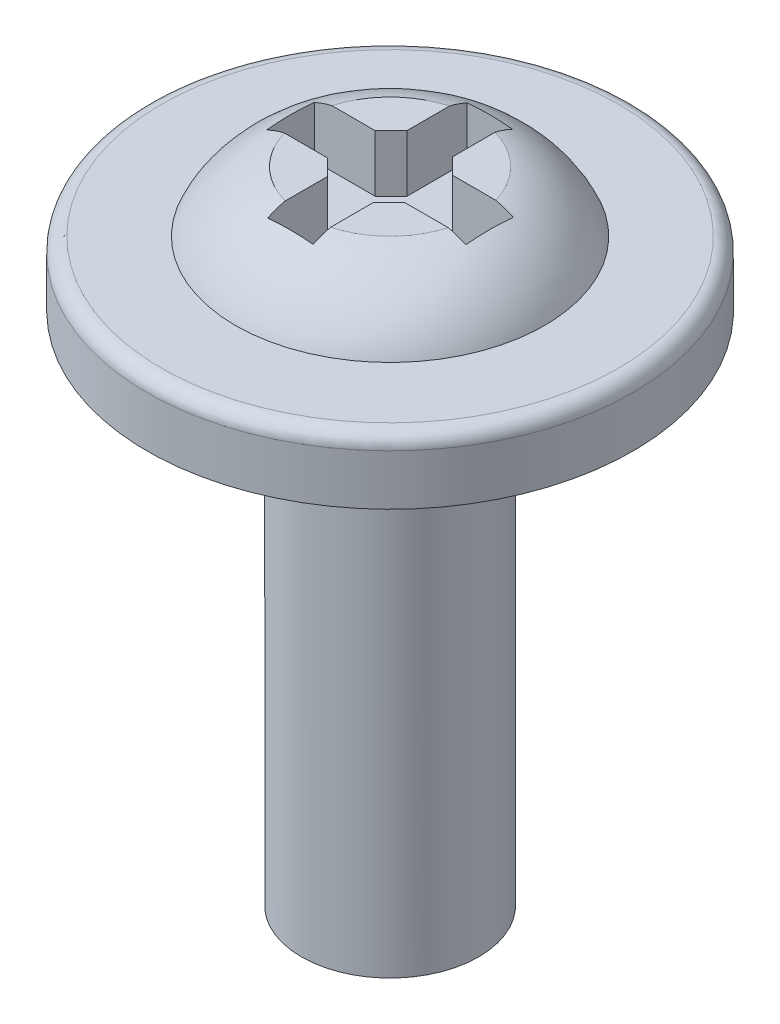
ISO-10303-21;
HEADER;
FILE_DESCRIPTION(('STEP AP214'),'2;1');
FILE_NAME('part.step','',(''),(''),'','','');
FILE_SCHEMA(('AUTOMOTIVE_DESIGN { 1 0 10303 214 1 1 1 1 }'));
ENDSEC;
DATA;
#1=APPLICATION_CONTEXT('core data for automotive mechanical design processes');
#2=APPLICATION_PROTOCOL_DEFINITION('international standard','automotive_design',2000,#1);
#3=PRODUCT_CONTEXT('',#1,'mechanical');
#4=PRODUCT('Part','Part','',(#3));
#5=PRODUCT_RELATED_PRODUCT_CATEGORY('part','',(#4));
#6=PRODUCT_DEFINITION_FORMATION('','',#4);
#7=PRODUCT_DEFINITION_CONTEXT('part definition',#1,'design');
#8=PRODUCT_DEFINITION('design','',#6,#7);
#9=PRODUCT_DEFINITION_SHAPE('','',#8);
#10=(LENGTH_UNIT() NAMED_UNIT(*) SI_UNIT(.MILLI.,.METRE.));
#11=(NAMED_UNIT(*) PLANE_ANGLE_UNIT() SI_UNIT($,.RADIAN.));
#12=(NAMED_UNIT(*) SI_UNIT($,.STERADIAN.) SOLID_ANGLE_UNIT());
#13=UNCERTAINTY_MEASURE_WITH_UNIT(LENGTH_MEASURE(1.E-05),#10,'distance_accuracy_value','');
#14=(GEOMETRIC_REPRESENTATION_CONTEXT(3) GLOBAL_UNCERTAINTY_ASSIGNED_CONTEXT((#13)) GLOBAL_UNIT_ASSIGNED_CONTEXT((#10,
#11,#12)) REPRESENTATION_CONTEXT('',''));
#15=CARTESIAN_POINT('',(0.,0.,0.));
#16=DIRECTION('',(0.,0.,1.));
#17=DIRECTION('',(1.,0.,0.));
#18=AXIS2_PLACEMENT_3D('',#15,#16,#17);
#19=CARTESIAN_POINT('',(0.,9.144,-1.905));
#20=CARTESIAN_POINT('',(0.,9.01320157506182,-2.48585998432291));
#21=CARTESIAN_POINT('',(0.,8.48184418233243,-3.16981228226771));
#22=CARTESIAN_POINT('',(0.,7.7978,-3.4544));
#23=B_SPLINE_CURVE_WITH_KNOTS('',3,(#19,#20,#21,#22),.UNSPECIFIED.,.F.,.F.,(4,4),(0.,1.),.UNSPECIFIED.);
#24=CARTESIAN_POINT('',(0.,0.,0.));
#25=DIRECTION('',(0.,-1.,0.));
#26=AXIS1_PLACEMENT('',#24,#25);
#27=SURFACE_OF_REVOLUTION('',#23,#26);
#28=CARTESIAN_POINT('',(0.,7.7978,0.));
#29=DIRECTION('',(0.,-1.,0.));
#30=DIRECTION('',(0.,0.,-1.));
#31=AXIS2_PLACEMENT_3D('',#28,#29,#30);
#32=CIRCLE('',#31,3.4544);
#33=CARTESIAN_POINT('',(0.,7.7978,-3.4544));
#34=VERTEX_POINT('',#33);
#35=EDGE_CURVE('E326',#34,#34,#32,.T.);
#36=ORIENTED_EDGE('',*,*,#35,.F.);
#37=EDGE_LOOP('',(#36));
#38=FACE_BOUND('',#37,.T.);
#39=CARTESIAN_POINT('',(-2.22356907078531,9.00798065412943,0.530600214329886));
#40=CARTESIAN_POINT('',(-2.20251859517427,9.01785875233319,0.530600214329887));
#41=CARTESIAN_POINT('',(-2.18130915061745,9.02740125202562,0.530600214329888));
#42=CARTESIAN_POINT('',(-2.13863931356944,9.04574501131848,0.530600214329889));
#43=CARTESIAN_POINT('',(-2.11717974075077,9.05454817904772,0.530600214329889));
#44=CARTESIAN_POINT('',(-2.07399660062318,9.0713837822004,0.530600214329889));
#45=CARTESIAN_POINT('',(-2.05227347592328,9.07941735013567,0.530600214329889));
#46=CARTESIAN_POINT('',(-2.00853950348615,9.09467652220501,0.530600214329889));
#47=CARTESIAN_POINT('',(-1.98652859427027,9.10190195044117,0.530600214329889));
#48=CARTESIAN_POINT('',(-1.94221027994457,9.11549093012651,0.530600214329889));
#49=CARTESIAN_POINT('',(-1.91990253137907,9.12185336652201,0.530600214329889));
#50=CARTESIAN_POINT('',(-1.87497312131895,9.1336498718535,0.530600214329889));
#51=CARTESIAN_POINT('',(-1.85235072870513,9.13908115092384,0.530600214329888));
#52=CARTESIAN_POINT('',(-1.82961427971938,9.144,0.530600214329888));
#53=B_SPLINE_CURVE_WITH_KNOTS('',3,(#39,#40,#41,#42,#43,#44,#45,#46,#47,#48,#49,#50,#51,#52),
.UNSPECIFIED.,.F.,.F.,(4,2,2,2,2,2,4),(0.,0.0697578375622904,0.139329720273001,
0.208797598407411,0.278280567461784,0.347852475761829,0.417629319570373),.UNSPECIFIED.);
#54=CARTESIAN_POINT('',(-2.22356907078532,9.00798065412943,0.530600214329889));
#55=VERTEX_POINT('',#54);
#56=CARTESIAN_POINT('',(-1.82961427971938,9.144,0.530600214329889));
#57=VERTEX_POINT('',#56);
#58=EDGE_CURVE('E321',#55,#57,#53,.T.);
#59=ORIENTED_EDGE('',*,*,#58,.F.);
#60=CARTESIAN_POINT('',(-2.22356907078531,9.00798065412943,0.530600214329886));
#61=CARTESIAN_POINT('',(-2.22356907078531,9.01292172062073,0.486453609451828));
#62=CARTESIAN_POINT('',(-2.22356907078532,9.01719128878245,0.442233933670321));
#63=CARTESIAN_POINT('',(-2.22356907078532,9.02443906175817,0.353789726310259));
#64=CARTESIAN_POINT('',(-2.22356907078532,9.02742017864067,0.309565434046432));
#65=CARTESIAN_POINT('',(-2.22356907078532,9.0321611274982,0.221116816199245));
#66=CARTESIAN_POINT('',(-2.22356907078532,9.03392273353333,0.176892584649752));
#67=CARTESIAN_POINT('',(-2.22356907078532,9.03626588327743,0.0884455535069008));
#68=CARTESIAN_POINT('',(-2.22356907078532,9.0368482934057,0.044222776753449));
#69=CARTESIAN_POINT('',(-2.22356907078532,9.0368482934057,-0.0442227767534545));
#70=CARTESIAN_POINT('',(-2.22356907078532,9.03626588327742,-0.0884455535069062));
#71=CARTESIAN_POINT('',(-2.22356907078532,9.03392273353333,-0.176892584649757));
#72=CARTESIAN_POINT('',(-2.22356907078532,9.0321611274982,-0.22111681619925));
#73=CARTESIAN_POINT('',(-2.22356907078532,9.02742017864067,-0.309565434046438));
#74=CARTESIAN_POINT('',(-2.22356907078532,9.02443906175817,-0.353789726310264));
#75=CARTESIAN_POINT('',(-2.22356907078532,9.01719128878245,-0.442233933670327));
#76=CARTESIAN_POINT('',(-2.22356907078532,9.01292172062073,-0.486453609451833));
#77=CARTESIAN_POINT('',(-2.22356907078532,9.00798065412942,-0.53060021432989));
#78=B_SPLINE_CURVE_WITH_KNOTS('',3,(#60,#61,#62,#63,#64,#65,#66,#67,#68,#69,#70,#71,#72,#73,#74,
#75,#76,#77),.UNSPECIFIED.,.F.,.F.,(4,2,2,2,2,2,2,2,4),(0.,0.13325858394194,0.266214390718465,
0.398976373822808,0.531640774033104,0.6643051742434,0.797067157347742,0.930022964124267,
1.06328154806621),.UNSPECIFIED.);
#79=CARTESIAN_POINT('',(-2.22356907078532,9.00798065412942,-0.53060021432989));
#80=VERTEX_POINT('',#79);
#81=EDGE_CURVE('E452',#55,#80,#78,.T.);
#82=ORIENTED_EDGE('',*,*,#81,.T.);
#83=CARTESIAN_POINT('',(-1.82961427971938,9.144,-0.530600214329889));
#84=CARTESIAN_POINT('',(-1.85235072870513,9.13908115092384,-0.53060021432989));
#85=CARTESIAN_POINT('',(-1.87497312131895,9.1336498718535,-0.53060021432989));
#86=CARTESIAN_POINT('',(-1.91990253137907,9.12185336652201,-0.53060021432989));
#87=CARTESIAN_POINT('',(-1.94221027994457,9.11549093012651,-0.53060021432989));
#88=CARTESIAN_POINT('',(-1.98652859427027,9.10190195044117,-0.53060021432989));
#89=CARTESIAN_POINT('',(-2.00853950348615,9.094676522205,-0.53060021432989));
#90=CARTESIAN_POINT('',(-2.05227347592329,9.07941735013567,-0.53060021432989));
#91=CARTESIAN_POINT('',(-2.07399660062318,9.0713837822004,-0.53060021432989));
#92=CARTESIAN_POINT('',(-2.11717974075078,9.05454817904772,-0.53060021432989));
#93=CARTESIAN_POINT('',(-2.13863931356945,9.04574501131848,-0.53060021432989));
#94=CARTESIAN_POINT('',(-2.18130915061746,9.02740125202562,-0.53060021432989));
#95=CARTESIAN_POINT('',(-2.20251859517428,9.01785875233318,-0.53060021432989));
#96=CARTESIAN_POINT('',(-2.22356907078531,9.00798065412941,-0.53060021432989));
#97=B_SPLINE_CURVE_WITH_KNOTS('',3,(#83,#84,#85,#86,#87,#88,#89,#90,#91,#92,#93,#94,#95,#96),
.UNSPECIFIED.,.F.,.F.,(4,2,2,2,2,2,4),(0.,0.069776843808546,0.139348752108593,0.208831721162967,
0.27829959929738,0.347871482008092,0.417629319570383),.UNSPECIFIED.);
#98=CARTESIAN_POINT('',(-1.82961427971938,9.144,-0.53060021432989));
#99=VERTEX_POINT('',#98);
#100=EDGE_CURVE('E327',#99,#80,#97,.T.);
#101=ORIENTED_EDGE('',*,*,#100,.F.);
#102=CARTESIAN_POINT('',(0.,9.144,0.));
#103=DIRECTION('',(0.,-1.,0.));
#104=DIRECTION('',(0.,0.,-1.));
#105=AXIS2_PLACEMENT_3D('',#102,#103,#104);
#106=CIRCLE('',#105,1.905);
#107=CARTESIAN_POINT('',(-0.508,9.144,-1.83601770143972));
#108=VERTEX_POINT('',#107);
#109=EDGE_CURVE('E351',#99,#108,#106,.T.);
#110=ORIENTED_EDGE('',*,*,#109,.T.);
#111=CARTESIAN_POINT('',(-0.508,9.144,-1.83601770143972));
#112=CARTESIAN_POINT('',(-0.508,9.13907728666221,-1.85869246368517));
#113=CARTESIAN_POINT('',(-0.508,9.1336422043337,-1.88125275403727));
#114=CARTESIAN_POINT('',(-0.508,9.12183893006872,-1.92605738722141));
#115=CARTESIAN_POINT('',(-0.508,9.11547353121335,-1.94830246446108));
#116=CARTESIAN_POINT('',(-0.508,9.10188009672631,-1.99249509073535));
#117=CARTESIAN_POINT('',(-0.508,9.09465317478961,-2.01444298391083));
#118=CARTESIAN_POINT('',(-0.508,9.07939290720724,-2.0580506972434));
#119=CARTESIAN_POINT('',(-0.508,9.07135973904738,-2.07971057961896));
#120=CARTESIAN_POINT('',(-0.508,9.05452708870218,-2.12276723828017));
#121=CARTESIAN_POINT('',(-0.508,9.04572647496224,-2.14416357110202));
#122=CARTESIAN_POINT('',(-0.508,9.02739016879894,-2.18670705080968));
#123=CARTESIAN_POINT('',(-0.508,9.01785257261316,-2.20785337780708));
#124=CARTESIAN_POINT('',(-0.508,9.00798065412942,-2.22884095439759));
#125=B_SPLINE_CURVE_WITH_KNOTS('',3,(#111,#112,#113,#114,#115,#116,#117,#118,#119,#120,#121,
#122,#123,#124),.UNSPECIFIED.,.F.,.F.,(4,2,2,2,2,2,4),(0.,0.069598365843174,0.138991913436484,
0.208296709070974,0.277586281379518,0.346979802814841,0.416558992350354),.UNSPECIFIED.);
#126=CARTESIAN_POINT('',(-0.508,9.00798065412944,-2.2288409543976));
#127=VERTEX_POINT('',#126);
#128=EDGE_CURVE('E415',#108,#127,#125,.T.);
#129=ORIENTED_EDGE('',*,*,#128,.T.);
#130=CARTESIAN_POINT('',(0.508000000000002,9.00798065412944,-2.22884095439759));
#131=CARTESIAN_POINT('',(0.465727683927626,9.01251055623519,-2.22884095439759));
#132=CARTESIAN_POINT('',(0.423391520364506,9.01642906411814,-2.2288409543976));
#133=CARTESIAN_POINT('',(0.338715286841423,9.02308657478128,-2.2288409543976));
#134=CARTESIAN_POINT('',(0.296375409730574,9.02582802404207,-2.2288409543976));
#135=CARTESIAN_POINT('',(0.211695632434225,9.03019026438769,-2.2288409543976));
#136=CARTESIAN_POINT('',(0.169355808841703,9.0318125574861,-2.2288409543976));
#137=CARTESIAN_POINT('',(0.084677311062257,9.0339708839213,-2.2288409543976));
#138=CARTESIAN_POINT('',(0.0423386555311302,9.03450765245975,-2.2288409543976));
#139=CARTESIAN_POINT('',(-0.0423386555311236,9.03450765245975,-2.2288409543976));
#140=CARTESIAN_POINT('',(-0.0846773110622505,9.0339708839213,-2.2288409543976));
#141=CARTESIAN_POINT('',(-0.169355808841696,9.0318125574861,-2.2288409543976));
#142=CARTESIAN_POINT('',(-0.211695632434219,9.03019026438769,-2.2288409543976));
#143=CARTESIAN_POINT('',(-0.296375409730568,9.02582802404207,-2.2288409543976));
#144=CARTESIAN_POINT('',(-0.338715286841417,9.02308657478128,-2.2288409543976));
#145=CARTESIAN_POINT('',(-0.423391520364499,9.01642906411813,-2.2288409543976));
#146=CARTESIAN_POINT('',(-0.46572768392762,9.01251055623518,-2.2288409543976));
#147=CARTESIAN_POINT('',(-0.507999999999994,9.00798065412942,-2.2288409543976));
#148=B_SPLINE_CURVE_WITH_KNOTS('',3,(#130,#131,#132,#133,#134,#135,#136,#137,#138,#139,#140,
#141,#142,#143,#144,#145,#146,#147),.UNSPECIFIED.,.F.,.F.,(4,2,2,2,2,2,2,2,4),(0.,
0.127536118282588,0.254805858077294,0.381904455774846,0.50891694354961,0.635929431324374,
0.763028029021926,0.890297768816632,1.01783388709922),.UNSPECIFIED.);
#149=CARTESIAN_POINT('',(0.508,9.00798065412944,-2.2288409543976));
#150=VERTEX_POINT('',#149);
#151=EDGE_CURVE('E378',#150,#127,#148,.T.);
#152=ORIENTED_EDGE('',*,*,#151,.F.);
#153=CARTESIAN_POINT('',(0.508000000000002,9.00798065412944,-2.22884095439759));
#154=CARTESIAN_POINT('',(0.508000000000001,9.01785257261317,-2.20785337780708));
#155=CARTESIAN_POINT('',(0.508,9.02739016879895,-2.18670705080967));
#156=CARTESIAN_POINT('',(0.508,9.04572647496224,-2.14416357110202));
#157=CARTESIAN_POINT('',(0.508,9.05452708870218,-2.12276723828016));
#158=CARTESIAN_POINT('',(0.508,9.07135973904738,-2.07971057961895));
#159=CARTESIAN_POINT('',(0.508,9.07939290720724,-2.0580506972434));
#160=CARTESIAN_POINT('',(0.508,9.09465317478961,-2.01444298391082));
#161=CARTESIAN_POINT('',(0.508,9.1018800967263,-1.99249509073534));
#162=CARTESIAN_POINT('',(0.508,9.11547353121335,-1.94830246446108));
#163=CARTESIAN_POINT('',(0.508,9.12183893006872,-1.92605738722141));
#164=CARTESIAN_POINT('',(0.508,9.13364220433371,-1.88125275403727));
#165=CARTESIAN_POINT('',(0.508,9.13907728666221,-1.85869246368517));
#166=CARTESIAN_POINT('',(0.508,9.144,-1.83601770143972));
#167=B_SPLINE_CURVE_WITH_KNOTS('',3,(#153,#154,#155,#156,#157,#158,#159,#160,#161,#162,#163,
#164,#165,#166),.UNSPECIFIED.,.F.,.F.,(4,2,2,2,2,2,4),(0.,0.0695791895355114,0.138972710970833,
0.208262283279376,0.277567078913865,0.346960626507173,0.416558992350346),.UNSPECIFIED.);
#168=CARTESIAN_POINT('',(0.508,9.144,-1.83601770143972));
#169=VERTEX_POINT('',#168);
#170=EDGE_CURVE('E409',#150,#169,#167,.T.);
#171=ORIENTED_EDGE('',*,*,#170,.T.);
#172=CARTESIAN_POINT('',(1.82961427971938,9.144,-0.53060021432989));
#173=VERTEX_POINT('',#172);
#174=EDGE_CURVE('E352',#169,#173,#106,.T.);
#175=ORIENTED_EDGE('',*,*,#174,.T.);
#176=CARTESIAN_POINT('',(2.22356907078532,9.00798065412942,-0.53060021432989));
#177=CARTESIAN_POINT('',(2.20251859517428,9.01785875233318,-0.53060021432989));
#178=CARTESIAN_POINT('',(2.18130915061746,9.02740125202562,-0.53060021432989));
#179=CARTESIAN_POINT('',(2.13863931356945,9.04574501131848,-0.53060021432989));
#180=CARTESIAN_POINT('',(2.11717974075078,9.05454817904772,-0.53060021432989));
#181=CARTESIAN_POINT('',(2.07399660062318,9.07138378220039,-0.53060021432989));
#182=CARTESIAN_POINT('',(2.05227347592329,9.07941735013567,-0.53060021432989));
#183=CARTESIAN_POINT('',(2.00853950348615,9.09467652220501,-0.53060021432989));
#184=CARTESIAN_POINT('',(1.98652859427028,9.10190195044117,-0.53060021432989));
#185=CARTESIAN_POINT('',(1.94221027994457,9.11549093012651,-0.53060021432989));
#186=CARTESIAN_POINT('',(1.91990253137907,9.12185336652201,-0.53060021432989));
#187=CARTESIAN_POINT('',(1.87497312131895,9.1336498718535,-0.53060021432989));
#188=CARTESIAN_POINT('',(1.85235072870513,9.13908115092383,-0.53060021432989));
#189=CARTESIAN_POINT('',(1.82961427971938,9.144,-0.53060021432989));
#190=B_SPLINE_CURVE_WITH_KNOTS('',3,(#176,#177,#178,#179,#180,#181,#182,#183,#184,#185,#186,
#187,#188,#189),.UNSPECIFIED.,.F.,.F.,(4,2,2,2,2,2,4),(0.,0.0697578375622916,0.139329720273005,
0.208797598407417,0.278280567461792,0.347852475761839,0.417629319570385),.UNSPECIFIED.);
#191=CARTESIAN_POINT('',(2.22356907078532,9.00798065412942,-0.53060021432989));
#192=VERTEX_POINT('',#191);
#193=EDGE_CURVE('E404',#192,#173,#190,.T.);
#194=ORIENTED_EDGE('',*,*,#193,.F.);
#195=CARTESIAN_POINT('',(2.22356907078531,9.00798065412942,0.530600214329891));
#196=CARTESIAN_POINT('',(2.22356907078532,9.01292172062073,0.486453609451833));
#197=CARTESIAN_POINT('',(2.22356907078532,9.01719128878246,0.442233933670326));
#198=CARTESIAN_POINT('',(2.22356907078532,9.02443906175817,0.353789726310264));
#199=CARTESIAN_POINT('',(2.22356907078532,9.02742017864067,0.309565434046437));
#200=CARTESIAN_POINT('',(2.22356907078532,9.0321611274982,0.221116816199249));
#201=CARTESIAN_POINT('',(2.22356907078532,9.03392273353333,0.176892584649756));
#202=CARTESIAN_POINT('',(2.22356907078532,9.03626588327742,0.0884455535069042));
#203=CARTESIAN_POINT('',(2.22356907078532,9.0368482934057,0.0442227767534523));
#204=CARTESIAN_POINT('',(2.22356907078532,9.0368482934057,-0.0442227767534516));
#205=CARTESIAN_POINT('',(2.22356907078532,9.03626588327742,-0.0884455535069035));
#206=CARTESIAN_POINT('',(2.22356907078532,9.03392273353333,-0.176892584649755));
#207=CARTESIAN_POINT('',(2.22356907078532,9.0321611274982,-0.221116816199248));
#208=CARTESIAN_POINT('',(2.22356907078532,9.02742017864067,-0.309565434046436));
#209=CARTESIAN_POINT('',(2.22356907078532,9.02443906175817,-0.353789726310263));
#210=CARTESIAN_POINT('',(2.22356907078532,9.01719128878246,-0.442233933670326));
#211=CARTESIAN_POINT('',(2.22356907078532,9.01292172062073,-0.486453609451833));
#212=CARTESIAN_POINT('',(2.22356907078532,9.00798065412942,-0.53060021432989));
#213=B_SPLINE_CURVE_WITH_KNOTS('',3,(#195,#196,#197,#198,#199,#200,#201,#202,#203,#204,#205,
#206,#207,#208,#209,#210,#211,#212),.UNSPECIFIED.,.F.,.F.,(4,2,2,2,2,2,2,2,4),(0.,
0.133258583941942,0.266214390718467,0.39897637382281,0.531640774033106,0.664305174243403,
0.797067157347746,0.930022964124271,1.06328154806621),.UNSPECIFIED.);
#214=CARTESIAN_POINT('',(2.22356907078532,9.00798065412942,0.530600214329889));
#215=VERTEX_POINT('',#214);
#216=EDGE_CURVE('E372',#215,#192,#213,.T.);
#217=ORIENTED_EDGE('',*,*,#216,.F.);
#218=CARTESIAN_POINT('',(1.82961427971938,9.144,0.530600214329889));
#219=CARTESIAN_POINT('',(1.85235072870513,9.13908115092384,0.530600214329889));
#220=CARTESIAN_POINT('',(1.87497312131895,9.1336498718535,0.530600214329889));
#221=CARTESIAN_POINT('',(1.91990253137907,9.12185336652201,0.530600214329889));
#222=CARTESIAN_POINT('',(1.94221027994457,9.11549093012651,0.530600214329889));
#223=CARTESIAN_POINT('',(1.98652859427027,9.10190195044117,0.530600214329889));
#224=CARTESIAN_POINT('',(2.00853950348615,9.09467652220501,0.530600214329889));
#225=CARTESIAN_POINT('',(2.05227347592329,9.07941735013567,0.530600214329889));
#226=CARTESIAN_POINT('',(2.07399660062318,9.0713837822004,0.530600214329889));
#227=CARTESIAN_POINT('',(2.11717974075077,9.05454817904772,0.530600214329889));
#228=CARTESIAN_POINT('',(2.13863931356945,9.04574501131848,0.530600214329889));
#229=CARTESIAN_POINT('',(2.18130915061746,9.02740125202562,0.530600214329889));
#230=CARTESIAN_POINT('',(2.20251859517428,9.01785875233318,0.530600214329889));
#231=CARTESIAN_POINT('',(2.22356907078531,9.00798065412942,0.530600214329888));
#232=B_SPLINE_CURVE_WITH_KNOTS('',3,(#218,#219,#220,#221,#222,#223,#224,#225,#226,#227,#228,
#229,#230,#231),.UNSPECIFIED.,.F.,.F.,(4,2,2,2,2,2,4),(0.,0.0697768438085454,0.139348752108592,
0.208831721162966,0.278299599297377,0.347871482008089,0.417629319570381),.UNSPECIFIED.);
#233=CARTESIAN_POINT('',(1.82961427971938,9.144,0.530600214329889));
#234=VERTEX_POINT('',#233);
#235=EDGE_CURVE('E399',#234,#215,#232,.T.);
#236=ORIENTED_EDGE('',*,*,#235,.F.);
#237=CARTESIAN_POINT('',(0.508,9.144,1.83601770143972));
#238=VERTEX_POINT('',#237);
#239=EDGE_CURVE('E356',#234,#238,#106,.T.);
#240=ORIENTED_EDGE('',*,*,#239,.T.);
#241=CARTESIAN_POINT('',(0.508,9.144,1.83601770143972));
#242=CARTESIAN_POINT('',(0.508,9.1390772866622,1.85869246368517));
#243=CARTESIAN_POINT('',(0.508,9.1336422043337,1.88125275403727));
#244=CARTESIAN_POINT('',(0.508,9.12183893006872,1.92605738722141));
#245=CARTESIAN_POINT('',(0.508,9.11547353121335,1.94830246446108));
#246=CARTESIAN_POINT('',(0.508,9.1018800967263,1.99249509073535));
#247=CARTESIAN_POINT('',(0.508,9.0946531747896,2.01444298391083));
#248=CARTESIAN_POINT('',(0.508,9.07939290720724,2.05805069724341));
#249=CARTESIAN_POINT('',(0.508,9.07135973904738,2.07971057961896));
#250=CARTESIAN_POINT('',(0.508,9.05452708870217,2.12276723828018));
#251=CARTESIAN_POINT('',(0.508,9.04572647496224,2.14416357110203));
#252=CARTESIAN_POINT('',(0.508,9.02739016879894,2.18670705080969));
#253=CARTESIAN_POINT('',(0.508,9.01785257261316,2.2078533778071));
#254=CARTESIAN_POINT('',(0.508,9.00798065412942,2.2288409543976));
#255=B_SPLINE_CURVE_WITH_KNOTS('',3,(#241,#242,#243,#244,#245,#246,#247,#248,#249,#250,#251,
#252,#253,#254),.UNSPECIFIED.,.F.,.F.,(4,2,2,2,2,2,4),(0.,0.0695983658431763,0.138991913436488,
0.20829670907098,0.277586281379527,0.346979802814851,0.416558992350367),.UNSPECIFIED.);
#256=CARTESIAN_POINT('',(0.508,9.00798065412942,2.2288409543976));
#257=VERTEX_POINT('',#256);
#258=EDGE_CURVE('E292',#238,#257,#255,.T.);
#259=ORIENTED_EDGE('',*,*,#258,.T.);
#260=CARTESIAN_POINT('',(0.508,9.00798065412942,2.2288409543976));
#261=CARTESIAN_POINT('',(0.465727683927625,9.01251055623518,2.2288409543976));
#262=CARTESIAN_POINT('',(0.423391520364505,9.01642906411814,2.2288409543976));
#263=CARTESIAN_POINT('',(0.338715286841422,9.02308657478128,2.2288409543976));
#264=CARTESIAN_POINT('',(0.296375409730572,9.02582802404207,2.2288409543976));
#265=CARTESIAN_POINT('',(0.211695632434223,9.03019026438768,2.2288409543976));
#266=CARTESIAN_POINT('',(0.1693558088417,9.0318125574861,2.2288409543976));
#267=CARTESIAN_POINT('',(0.0846773110622541,9.0339708839213,2.2288409543976));
#268=CARTESIAN_POINT('',(0.0423386555311271,9.03450765245975,2.2288409543976));
#269=CARTESIAN_POINT('',(-0.0423386555311269,9.03450765245975,2.2288409543976));
#270=CARTESIAN_POINT('',(-0.0846773110622539,9.0339708839213,2.2288409543976));
#271=CARTESIAN_POINT('',(-0.1693558088417,9.0318125574861,2.2288409543976));
#272=CARTESIAN_POINT('',(-0.211695632434223,9.03019026438769,2.2288409543976));
#273=CARTESIAN_POINT('',(-0.296375409730572,9.02582802404207,2.2288409543976));
#274=CARTESIAN_POINT('',(-0.338715286841421,9.02308657478128,2.2288409543976));
#275=CARTESIAN_POINT('',(-0.423391520364504,9.01642906411813,2.2288409543976));
#276=CARTESIAN_POINT('',(-0.465727683927625,9.01251055623518,2.2288409543976));
#277=CARTESIAN_POINT('',(-0.508,9.00798065412942,2.2288409543976));
#278=B_SPLINE_CURVE_WITH_KNOTS('',3,(#260,#261,#262,#263,#264,#265,#266,#267,#268,#269,#270,
#271,#272,#273,#274,#275,#276,#277),.UNSPECIFIED.,.F.,.F.,(4,2,2,2,2,2,2,2,4),(0.,
0.12753611828259,0.254805858077296,0.381904455774849,0.508916943549613,0.635929431324378,
0.76302802902193,0.890297768816637,1.01783388709923),.UNSPECIFIED.);
#279=CARTESIAN_POINT('',(-0.508,9.00798065412942,2.2288409543976));
#280=VERTEX_POINT('',#279);
#281=EDGE_CURVE('E366',#257,#280,#278,.T.);
#282=ORIENTED_EDGE('',*,*,#281,.T.);
#283=CARTESIAN_POINT('',(-0.508,9.00798065412942,2.2288409543976));
#284=CARTESIAN_POINT('',(-0.508,9.01785257261316,2.2078533778071));
#285=CARTESIAN_POINT('',(-0.508,9.02739016879894,2.18670705080969));
#286=CARTESIAN_POINT('',(-0.508,9.04572647496224,2.14416357110203));
#287=CARTESIAN_POINT('',(-0.508,9.05452708870217,2.12276723828018));
#288=CARTESIAN_POINT('',(-0.508,9.07135973904738,2.07971057961896));
#289=CARTESIAN_POINT('',(-0.508,9.07939290720724,2.05805069724341));
#290=CARTESIAN_POINT('',(-0.508,9.0946531747896,2.01444298391083));
#291=CARTESIAN_POINT('',(-0.508,9.1018800967263,1.99249509073535));
#292=CARTESIAN_POINT('',(-0.508,9.11547353121334,1.94830246446108));
#293=CARTESIAN_POINT('',(-0.508,9.12183893006872,1.92605738722141));
#294=CARTESIAN_POINT('',(-0.508,9.1336422043337,1.88125275403727));
#295=CARTESIAN_POINT('',(-0.508,9.13907728666221,1.85869246368517));
#296=CARTESIAN_POINT('',(-0.508,9.144,1.83601770143972));
#297=B_SPLINE_CURVE_WITH_KNOTS('',3,(#283,#284,#285,#286,#287,#288,#289,#290,#291,#292,#293,
#294,#295,#296),.UNSPECIFIED.,.F.,.F.,(4,2,2,2,2,2,4),(0.,0.0695791895355161,0.138972710970841,
0.208262283279386,0.277567078913878,0.34696062650719,0.416558992350367),.UNSPECIFIED.);
#298=CARTESIAN_POINT('',(-0.508,9.144,1.83601770143972));
#299=VERTEX_POINT('',#298);
#300=EDGE_CURVE('E249',#280,#299,#297,.T.);
#301=ORIENTED_EDGE('',*,*,#300,.T.);
#302=EDGE_CURVE('E454',#299,#57,#106,.T.);
#303=ORIENTED_EDGE('',*,*,#302,.T.);
#304=EDGE_LOOP('',(#59,#82,#101,#110,#129,#152,#171,#175,#194,#217,#236,#240,#259,#282,#301,#303));
#305=FACE_BOUND('',#304,.T.);
#306=ADVANCED_FACE('F37',(#38,#305),#27,.T.);
#307=CARTESIAN_POINT('',(0.,9.144,0.));
#308=DIRECTION('',(0.,-1.,0.));
#309=DIRECTION('',(0.,0.,-1.));
#310=AXIS2_PLACEMENT_3D('',#307,#308,#309);
#311=PLANE('',#310);
#312=DIRECTION('',(-1.,0.,0.));
#313=VECTOR('',#312,1.);
#314=CARTESIAN_POINT('',(0.,9.144,-0.53060021432989));
#315=LINE('',#314,#313);
#316=CARTESIAN_POINT('',(-0.861964761186199,9.144,-0.53060021432989));
#317=VERTEX_POINT('',#316);
#318=EDGE_CURVE('E364',#317,#99,#315,.T.);
#319=ORIENTED_EDGE('',*,*,#318,.F.);
#320=DIRECTION('',(0.707106781186539,0.,-0.707106781186557));
#321=VECTOR('',#320,1.);
#322=CARTESIAN_POINT('',(-0.696282487758055,9.144,-0.696282487758038));
#323=LINE('',#322,#321);
#324=CARTESIAN_POINT('',(-0.508,9.144,-0.884564975516098));
#325=VERTEX_POINT('',#324);
#326=EDGE_CURVE('E196',#317,#325,#323,.T.);
#327=ORIENTED_EDGE('',*,*,#326,.T.);
#328=DIRECTION('',(0.,0.,-1.));
#329=VECTOR('',#328,1.);
#330=CARTESIAN_POINT('',(-0.508,9.144,0.));
#331=LINE('',#330,#329);
#332=EDGE_CURVE('E361',#325,#108,#331,.T.);
#333=ORIENTED_EDGE('',*,*,#332,.T.);
#334=ORIENTED_EDGE('',*,*,#109,.F.);
#335=EDGE_LOOP('',(#319,#327,#333,#334));
#336=FACE_BOUND('',#335,.T.);
#337=ADVANCED_FACE('F438',(#336),#311,.F.);
#338=DIRECTION('',(1.,0.,0.));
#339=VECTOR('',#338,1.);
#340=CARTESIAN_POINT('',(0.,9.144,0.530600214329889));
#341=LINE('',#340,#339);
#342=CARTESIAN_POINT('',(0.861964761186181,9.144,0.530600214329889));
#343=VERTEX_POINT('',#342);
#344=EDGE_CURVE('E359',#343,#234,#341,.T.);
#345=ORIENTED_EDGE('',*,*,#344,.F.);
#346=DIRECTION('',(-0.707106781186539,0.,0.707106781186556));
#347=VECTOR('',#346,1.);
#348=CARTESIAN_POINT('',(0.696282487758045,9.144,0.696282487758028));
#349=LINE('',#348,#347);
#350=CARTESIAN_POINT('',(0.508,9.144,0.884564975516078));
#351=VERTEX_POINT('',#350);
#352=EDGE_CURVE('E237',#343,#351,#349,.T.);
#353=ORIENTED_EDGE('',*,*,#352,.T.);
#354=DIRECTION('',(0.,0.,1.));
#355=VECTOR('',#354,1.);
#356=CARTESIAN_POINT('',(0.508,9.144,0.));
#357=LINE('',#356,#355);
#358=EDGE_CURVE('E355',#351,#238,#357,.T.);
#359=ORIENTED_EDGE('',*,*,#358,.T.);
#360=ORIENTED_EDGE('',*,*,#239,.F.);
#361=EDGE_LOOP('',(#345,#353,#359,#360));
#362=FACE_BOUND('',#361,.T.);
#363=ADVANCED_FACE('F443',(#362),#311,.F.);
#364=DIRECTION('',(-1.,0.,0.));
#365=VECTOR('',#364,1.);
#366=CARTESIAN_POINT('',(0.,9.144,0.530600214329888));
#367=LINE('',#366,#365);
#368=CARTESIAN_POINT('',(-0.861964761186199,9.144,0.530600214329889));
#369=VERTEX_POINT('',#368);
#370=EDGE_CURVE('E52',#369,#57,#367,.T.);
#371=ORIENTED_EDGE('',*,*,#370,.T.);
#372=ORIENTED_EDGE('',*,*,#302,.F.);
#373=DIRECTION('',(0.,0.,1.));
#374=VECTOR('',#373,1.);
#375=CARTESIAN_POINT('',(-0.508,9.144,0.));
#376=LINE('',#375,#374);
#377=CARTESIAN_POINT('',(-0.508,9.144,0.884564975516078));
#378=VERTEX_POINT('',#377);
#379=EDGE_CURVE('E235',#378,#299,#376,.T.);
#380=ORIENTED_EDGE('',*,*,#379,.F.);
#381=DIRECTION('',(-0.707106781186557,0.,-0.707106781186539));
#382=VECTOR('',#381,1.);
#383=CARTESIAN_POINT('',(-0.696282487758033,9.144,0.696282487758051));
#384=LINE('',#383,#382);
#385=EDGE_CURVE('E233',#378,#369,#384,.T.);
#386=ORIENTED_EDGE('',*,*,#385,.T.);
#387=EDGE_LOOP('',(#371,#372,#380,#386));
#388=FACE_BOUND('',#387,.T.);
#389=ADVANCED_FACE('F456',(#388),#311,.F.);
#390=ORIENTED_EDGE('',*,*,#174,.F.);
#391=DIRECTION('',(0.,0.,-1.));
#392=VECTOR('',#391,1.);
#393=CARTESIAN_POINT('',(0.508,9.144,0.));
#394=LINE('',#393,#392);
#395=CARTESIAN_POINT('',(0.508,9.144,-0.884564975516098));
#396=VERTEX_POINT('',#395);
#397=EDGE_CURVE('E199',#396,#169,#394,.T.);
#398=ORIENTED_EDGE('',*,*,#397,.F.);
#399=DIRECTION('',(0.707106781186556,0.,0.707106781186539));
#400=VECTOR('',#399,1.);
#401=CARTESIAN_POINT('',(0.696282487758043,9.144,-0.69628248775806));
#402=LINE('',#401,#400);
#403=CARTESIAN_POINT('',(0.861964761186216,9.144,-0.53060021432989));
#404=VERTEX_POINT('',#403);
#405=EDGE_CURVE('E243',#396,#404,#402,.T.);
#406=ORIENTED_EDGE('',*,*,#405,.T.);
#407=DIRECTION('',(1.,0.,0.));
#408=VECTOR('',#407,1.);
#409=CARTESIAN_POINT('',(0.,9.144,-0.53060021432989));
#410=LINE('',#409,#408);
#411=EDGE_CURVE('E240',#404,#173,#410,.T.);
#412=ORIENTED_EDGE('',*,*,#411,.T.);
#413=EDGE_LOOP('',(#390,#398,#406,#412));
#414=FACE_BOUND('',#413,.T.);
#415=ADVANCED_FACE('F445',(#414),#311,.F.);
#416=CARTESIAN_POINT('',(0.,-5.15261801381829,0.));
#417=DIRECTION('',(0.,1.,0.));
#418=DIRECTION('',(0.,0.,1.));
#419=AXIS2_PLACEMENT_3D('',#416,#417,#418);
#420=CONICAL_SURFACE('',#419,1.9812,1.02716825384944);
#421=CARTESIAN_POINT('',(0.,-6.35,0.));
#422=VERTEX_POINT('',#421);
#423=VERTEX_LOOP('',#422);
#424=FACE_BOUND('',#423,.T.);
#425=CARTESIAN_POINT('',(0.,-5.15261801381829,0.));
#426=DIRECTION('',(0.,-1.,0.));
#427=DIRECTION('',(0.,0.,-1.));
#428=AXIS2_PLACEMENT_3D('',#425,#426,#427);
#429=CIRCLE('',#428,1.9812);
#430=CARTESIAN_POINT('',(0.,-5.15261801381829,-1.9812));
#431=VERTEX_POINT('',#430);
#432=EDGE_CURVE('E348',#431,#431,#429,.T.);
#433=ORIENTED_EDGE('',*,*,#432,.T.);
#434=EDGE_LOOP('',(#433));
#435=FACE_BOUND('',#434,.T.);
#436=ADVANCED_FACE('F524',(#424,#435),#420,.T.);
#437=CARTESIAN_POINT('',(0.,0.,0.));
#438=DIRECTION('',(0.,-1.,0.));
#439=DIRECTION('',(0.,0.,-1.));
#440=AXIS2_PLACEMENT_3D('',#437,#438,#439);
#441=CYLINDRICAL_SURFACE('',#440,1.9812);
#442=CARTESIAN_POINT('',(0.,6.35,0.));
#443=DIRECTION('',(0.,-1.,0.));
#444=DIRECTION('',(0.,0.,-1.));
#445=AXIS2_PLACEMENT_3D('',#442,#443,#444);
#446=CIRCLE('',#445,1.9812);
#447=CARTESIAN_POINT('',(0.,6.35,-1.9812));
#448=VERTEX_POINT('',#447);
#449=EDGE_CURVE('E345',#448,#448,#446,.T.);
#450=ORIENTED_EDGE('',*,*,#449,.T.);
#451=EDGE_LOOP('',(#450));
#452=FACE_BOUND('',#451,.T.);
#453=ORIENTED_EDGE('',*,*,#432,.F.);
#454=EDGE_LOOP('',(#453));
#455=FACE_BOUND('',#454,.T.);
#456=ADVANCED_FACE('F527',(#452,#455),#441,.T.);
#457=CARTESIAN_POINT('',(0.,6.35,0.));
#458=DIRECTION('',(0.,-1.,0.));
#459=DIRECTION('',(0.,0.,-1.));
#460=AXIS2_PLACEMENT_3D('',#457,#458,#459);
#461=PLANE('',#460);
#462=CARTESIAN_POINT('',(0.,6.35,0.));
#463=DIRECTION('',(0.,-1.,0.));
#464=DIRECTION('',(0.,0.,-1.));
#465=AXIS2_PLACEMENT_3D('',#462,#463,#464);
#466=CIRCLE('',#465,5.4229);
#467=CARTESIAN_POINT('',(0.,6.35,-5.4229));
#468=VERTEX_POINT('',#467);
#469=EDGE_CURVE('E342',#468,#468,#466,.T.);
#470=ORIENTED_EDGE('',*,*,#469,.T.);
#471=EDGE_LOOP('',(#470));
#472=FACE_BOUND('',#471,.T.);
#473=ORIENTED_EDGE('',*,*,#449,.F.);
#474=EDGE_LOOP('',(#473));
#475=FACE_BOUND('',#474,.T.);
#476=ADVANCED_FACE('F530',(#472,#475),#461,.T.);
#477=CARTESIAN_POINT('',(0.,0.,0.));
#478=DIRECTION('',(0.,-1.,0.));
#479=DIRECTION('',(0.,0.,-1.));
#480=AXIS2_PLACEMENT_3D('',#477,#478,#479);
#481=CYLINDRICAL_SURFACE('',#480,5.4229);
#482=CARTESIAN_POINT('',(0.,7.4803,0.));
#483=DIRECTION('',(0.,-1.,0.));
#484=DIRECTION('',(0.,0.,-1.));
#485=AXIS2_PLACEMENT_3D('',#482,#483,#484);
#486=CIRCLE('',#485,5.4229);
#487=CARTESIAN_POINT('',(0.,7.4803,-5.4229));
#488=VERTEX_POINT('',#487);
#489=EDGE_CURVE('E45',#488,#488,#486,.T.);
#490=ORIENTED_EDGE('',*,*,#489,.T.);
#491=EDGE_LOOP('',(#490));
#492=FACE_BOUND('',#491,.T.);
#493=ORIENTED_EDGE('',*,*,#469,.F.);
#494=EDGE_LOOP('',(#493));
#495=FACE_BOUND('',#494,.T.);
#496=ADVANCED_FACE('F533',(#492,#495),#481,.T.);
#497=CARTESIAN_POINT('',(0.,7.7978,0.));
#498=DIRECTION('',(0.,-1.,0.));
#499=DIRECTION('',(0.,0.,-1.));
#500=AXIS2_PLACEMENT_3D('',#497,#498,#499);
#501=PLANE('',#500);
#502=CARTESIAN_POINT('',(0.,7.7978,0.));
#503=DIRECTION('',(0.,-1.,0.));
#504=DIRECTION('',(0.,0.,-1.));
#505=AXIS2_PLACEMENT_3D('',#502,#503,#504);
#506=CIRCLE('',#505,5.1054);
#507=CARTESIAN_POINT('',(0.,7.7978,-5.1054));
#508=VERTEX_POINT('',#507);
#509=EDGE_CURVE('E11',#508,#508,#506,.F.);
#510=ORIENTED_EDGE('',*,*,#509,.T.);
#511=EDGE_LOOP('',(#510));
#512=FACE_BOUND('',#511,.T.);
#513=ORIENTED_EDGE('',*,*,#35,.T.);
#514=EDGE_LOOP('',(#513));
#515=FACE_BOUND('',#514,.T.);
#516=ADVANCED_FACE('F318',(#512,#515),#501,.F.);
#517=CARTESIAN_POINT('',(-2.22356907078532,7.874,0.));
#518=DIRECTION('',(-1.,0.,0.));
#519=DIRECTION('',(0.,0.,1.));
#520=AXIS2_PLACEMENT_3D('',#517,#518,#519);
#521=PLANE('',#520);
#522=DIRECTION('',(0.,1.,0.));
#523=VECTOR('',#522,1.);
#524=CARTESIAN_POINT('',(-2.22356907078532,7.874,0.530600214329889));
#525=LINE('',#524,#523);
#526=CARTESIAN_POINT('',(-2.22356907078532,7.874,0.530600214329889));
#527=VERTEX_POINT('',#526);
#528=EDGE_CURVE('E247',#527,#55,#525,.T.);
#529=ORIENTED_EDGE('',*,*,#528,.F.);
#530=DIRECTION('',(0.,0.,1.));
#531=VECTOR('',#530,1.);
#532=CARTESIAN_POINT('',(-2.22356907078532,7.874,0.));
#533=LINE('',#532,#531);
#534=CARTESIAN_POINT('',(-2.22356907078532,7.874,-0.53060021432989));
#535=VERTEX_POINT('',#534);
#536=EDGE_CURVE('E190',#535,#527,#533,.T.);
#537=ORIENTED_EDGE('',*,*,#536,.F.);
#538=DIRECTION('',(0.,1.,0.));
#539=VECTOR('',#538,1.);
#540=CARTESIAN_POINT('',(-2.22356907078532,7.874,-0.53060021432989));
#541=LINE('',#540,#539);
#542=EDGE_CURVE('E250',#535,#80,#541,.T.);
#543=ORIENTED_EDGE('',*,*,#542,.T.);
#544=ORIENTED_EDGE('',*,*,#81,.F.);
#545=EDGE_LOOP('',(#529,#537,#543,#544));
#546=FACE_BOUND('',#545,.T.);
#547=ADVANCED_FACE('F497',(#546),#521,.F.);
#548=CARTESIAN_POINT('',(0.,7.874,-2.2288409543976));
#549=DIRECTION('',(0.,0.,1.));
#550=DIRECTION('',(1.,0.,0.));
#551=AXIS2_PLACEMENT_3D('',#548,#549,#550);
#552=PLANE('',#551);
#553=ORIENTED_EDGE('',*,*,#151,.T.);
#554=DIRECTION('',(0.,1.,0.));
#555=VECTOR('',#554,1.);
#556=CARTESIAN_POINT('',(-0.508,7.874,-2.2288409543976));
#557=LINE('',#556,#555);
#558=CARTESIAN_POINT('',(-0.508,7.874,-2.2288409543976));
#559=VERTEX_POINT('',#558);
#560=EDGE_CURVE('E258',#559,#127,#557,.T.);
#561=ORIENTED_EDGE('',*,*,#560,.F.);
#562=DIRECTION('',(1.,0.,0.));
#563=VECTOR('',#562,1.);
#564=CARTESIAN_POINT('',(0.,7.874,-2.2288409543976));
#565=LINE('',#564,#563);
#566=CARTESIAN_POINT('',(0.508,7.874,-2.2288409543976));
#567=VERTEX_POINT('',#566);
#568=EDGE_CURVE('E222',#559,#567,#565,.T.);
#569=ORIENTED_EDGE('',*,*,#568,.T.);
#570=DIRECTION('',(0.,1.,0.));
#571=VECTOR('',#570,1.);
#572=CARTESIAN_POINT('',(0.508,7.874,-2.2288409543976));
#573=LINE('',#572,#571);
#574=EDGE_CURVE('E261',#567,#150,#573,.T.);
#575=ORIENTED_EDGE('',*,*,#574,.T.);
#576=EDGE_LOOP('',(#553,#561,#569,#575));
#577=FACE_BOUND('',#576,.T.);
#578=ADVANCED_FACE('F389',(#577),#552,.T.);
#579=CARTESIAN_POINT('',(2.22356907078532,7.874,0.));
#580=DIRECTION('',(-1.,0.,0.));
#581=DIRECTION('',(0.,0.,1.));
#582=AXIS2_PLACEMENT_3D('',#579,#580,#581);
#583=PLANE('',#582);
#584=ORIENTED_EDGE('',*,*,#216,.T.);
#585=DIRECTION('',(0.,1.,0.));
#586=VECTOR('',#585,1.);
#587=CARTESIAN_POINT('',(2.22356907078532,7.874,-0.53060021432989));
#588=LINE('',#587,#586);
#589=CARTESIAN_POINT('',(2.22356907078532,7.874,-0.53060021432989));
#590=VERTEX_POINT('',#589);
#591=EDGE_CURVE('E268',#590,#192,#588,.T.);
#592=ORIENTED_EDGE('',*,*,#591,.F.);
#593=DIRECTION('',(0.,0.,1.));
#594=VECTOR('',#593,1.);
#595=CARTESIAN_POINT('',(2.22356907078532,7.874,0.));
#596=LINE('',#595,#594);
#597=CARTESIAN_POINT('',(2.22356907078532,7.874,0.530600214329889));
#598=VERTEX_POINT('',#597);
#599=EDGE_CURVE('E213',#590,#598,#596,.T.);
#600=ORIENTED_EDGE('',*,*,#599,.T.);
#601=DIRECTION('',(0.,1.,0.));
#602=VECTOR('',#601,1.);
#603=CARTESIAN_POINT('',(2.22356907078532,7.874,0.530600214329889));
#604=LINE('',#603,#602);
#605=EDGE_CURVE('E271',#598,#215,#604,.T.);
#606=ORIENTED_EDGE('',*,*,#605,.T.);
#607=EDGE_LOOP('',(#584,#592,#600,#606));
#608=FACE_BOUND('',#607,.T.);
#609=ADVANCED_FACE('F384',(#608),#583,.T.);
#610=CARTESIAN_POINT('',(0.,7.874,2.2288409543976));
#611=DIRECTION('',(0.,0.,1.));
#612=DIRECTION('',(1.,0.,0.));
#613=AXIS2_PLACEMENT_3D('',#610,#611,#612);
#614=PLANE('',#613);
#615=DIRECTION('',(0.,1.,0.));
#616=VECTOR('',#615,1.);
#617=CARTESIAN_POINT('',(0.508,7.874,2.2288409543976));
#618=LINE('',#617,#616);
#619=CARTESIAN_POINT('',(0.508,7.874,2.2288409543976));
#620=VERTEX_POINT('',#619);
#621=EDGE_CURVE('E279',#620,#257,#618,.T.);
#622=ORIENTED_EDGE('',*,*,#621,.F.);
#623=DIRECTION('',(1.,0.,0.));
#624=VECTOR('',#623,1.);
#625=CARTESIAN_POINT('',(0.,7.874,2.2288409543976));
#626=LINE('',#625,#624);
#627=CARTESIAN_POINT('',(-0.508,7.874,2.2288409543976));
#628=VERTEX_POINT('',#627);
#629=EDGE_CURVE('E203',#628,#620,#626,.T.);
#630=ORIENTED_EDGE('',*,*,#629,.F.);
#631=DIRECTION('',(0.,1.,0.));
#632=VECTOR('',#631,1.);
#633=CARTESIAN_POINT('',(-0.508,7.874,2.2288409543976));
#634=LINE('',#633,#632);
#635=EDGE_CURVE('E282',#628,#280,#634,.T.);
#636=ORIENTED_EDGE('',*,*,#635,.T.);
#637=ORIENTED_EDGE('',*,*,#281,.F.);
#638=EDGE_LOOP('',(#622,#630,#636,#637));
#639=FACE_BOUND('',#638,.T.);
#640=ADVANCED_FACE('F309',(#639),#614,.F.);
#641=CARTESIAN_POINT('',(0.,7.874,0.530600214329888));
#642=DIRECTION('',(0.,0.,-1.));
#643=DIRECTION('',(-1.,0.,0.));
#644=AXIS2_PLACEMENT_3D('',#641,#642,#643);
#645=PLANE('',#644);
#646=ORIENTED_EDGE('',*,*,#58,.T.);
#647=ORIENTED_EDGE('',*,*,#370,.F.);
#648=DIRECTION('',(0.,1.,0.));
#649=VECTOR('',#648,1.);
#650=CARTESIAN_POINT('',(-0.861964761186199,7.874,0.530600214329889));
#651=LINE('',#650,#649);
#652=CARTESIAN_POINT('',(-0.861964761186199,7.874,0.530600214329889));
#653=VERTEX_POINT('',#652);
#654=EDGE_CURVE('E177',#653,#369,#651,.T.);
#655=ORIENTED_EDGE('',*,*,#654,.F.);
#656=DIRECTION('',(-1.,0.,0.));
#657=VECTOR('',#656,1.);
#658=CARTESIAN_POINT('',(0.,7.874,0.530600214329888));
#659=LINE('',#658,#657);
#660=EDGE_CURVE('E185',#653,#527,#659,.T.);
#661=ORIENTED_EDGE('',*,*,#660,.T.);
#662=ORIENTED_EDGE('',*,*,#528,.T.);
#663=EDGE_LOOP('',(#646,#647,#655,#661,#662));
#664=FACE_BOUND('',#663,.T.);
#665=ADVANCED_FACE('F187',(#664),#645,.T.);
#666=CARTESIAN_POINT('',(0.,7.874,-0.53060021432989));
#667=DIRECTION('',(0.,0.,1.));
#668=DIRECTION('',(1.,0.,0.));
#669=AXIS2_PLACEMENT_3D('',#666,#667,#668);
#670=PLANE('',#669);
#671=ORIENTED_EDGE('',*,*,#100,.T.);
#672=ORIENTED_EDGE('',*,*,#542,.F.);
#673=DIRECTION('',(1.,0.,0.));
#674=VECTOR('',#673,1.);
#675=CARTESIAN_POINT('',(0.,7.874,-0.53060021432989));
#676=LINE('',#675,#674);
#677=CARTESIAN_POINT('',(-0.861964761186199,7.874,-0.53060021432989));
#678=VERTEX_POINT('',#677);
#679=EDGE_CURVE('E229',#535,#678,#676,.T.);
#680=ORIENTED_EDGE('',*,*,#679,.T.);
#681=DIRECTION('',(0.,1.,0.));
#682=VECTOR('',#681,1.);
#683=CARTESIAN_POINT('',(-0.861964761186199,7.874,-0.53060021432989));
#684=LINE('',#683,#682);
#685=EDGE_CURVE('E253',#678,#317,#684,.T.);
#686=ORIENTED_EDGE('',*,*,#685,.T.);
#687=ORIENTED_EDGE('',*,*,#318,.T.);
#688=EDGE_LOOP('',(#671,#672,#680,#686,#687));
#689=FACE_BOUND('',#688,.T.);
#690=ADVANCED_FACE('F317',(#689),#670,.T.);
#691=CARTESIAN_POINT('',(-0.508,7.874,0.));
#692=DIRECTION('',(-1.,0.,0.));
#693=DIRECTION('',(0.,0.,1.));
#694=AXIS2_PLACEMENT_3D('',#691,#692,#693);
#695=PLANE('',#694);
#696=ORIENTED_EDGE('',*,*,#332,.F.);
#697=DIRECTION('',(0.,1.,0.));
#698=VECTOR('',#697,1.);
#699=CARTESIAN_POINT('',(-0.508,7.874,-0.884564975516098));
#700=LINE('',#699,#698);
#701=CARTESIAN_POINT('',(-0.508,7.874,-0.884564975516098));
#702=VERTEX_POINT('',#701);
#703=EDGE_CURVE('E255',#702,#325,#700,.T.);
#704=ORIENTED_EDGE('',*,*,#703,.F.);
#705=DIRECTION('',(0.,0.,1.));
#706=VECTOR('',#705,1.);
#707=CARTESIAN_POINT('',(-0.508,7.874,0.));
#708=LINE('',#707,#706);
#709=EDGE_CURVE('E224',#559,#702,#708,.T.);
#710=ORIENTED_EDGE('',*,*,#709,.F.);
#711=ORIENTED_EDGE('',*,*,#560,.T.);
#712=ORIENTED_EDGE('',*,*,#128,.F.);
#713=EDGE_LOOP('',(#696,#704,#710,#711,#712));
#714=FACE_BOUND('',#713,.T.);
#715=ADVANCED_FACE('F423',(#714),#695,.F.);
#716=CARTESIAN_POINT('',(0.508,7.874,0.));
#717=DIRECTION('',(1.,0.,0.));
#718=DIRECTION('',(0.,0.,-1.));
#719=AXIS2_PLACEMENT_3D('',#716,#717,#718);
#720=PLANE('',#719);
#721=ORIENTED_EDGE('',*,*,#574,.F.);
#722=DIRECTION('',(0.,0.,-1.));
#723=VECTOR('',#722,1.);
#724=CARTESIAN_POINT('',(0.508,7.874,0.));
#725=LINE('',#724,#723);
#726=CARTESIAN_POINT('',(0.508,7.874,-0.884564975516098));
#727=VERTEX_POINT('',#726);
#728=EDGE_CURVE('E219',#727,#567,#725,.T.);
#729=ORIENTED_EDGE('',*,*,#728,.F.);
#730=DIRECTION('',(0.,1.,0.));
#731=VECTOR('',#730,1.);
#732=CARTESIAN_POINT('',(0.508,7.874,-0.884564975516098));
#733=LINE('',#732,#731);
#734=EDGE_CURVE('E264',#727,#396,#733,.T.);
#735=ORIENTED_EDGE('',*,*,#734,.T.);
#736=ORIENTED_EDGE('',*,*,#397,.T.);
#737=ORIENTED_EDGE('',*,*,#170,.F.);
#738=EDGE_LOOP('',(#721,#729,#735,#736,#737));
#739=FACE_BOUND('',#738,.T.);
#740=ADVANCED_FACE('F420',(#739),#720,.F.);
#741=CARTESIAN_POINT('',(0.,7.874,-0.53060021432989));
#742=DIRECTION('',(0.,0.,1.));
#743=DIRECTION('',(1.,0.,0.));
#744=AXIS2_PLACEMENT_3D('',#741,#742,#743);
#745=PLANE('',#744);
#746=ORIENTED_EDGE('',*,*,#193,.T.);
#747=ORIENTED_EDGE('',*,*,#411,.F.);
#748=DIRECTION('',(0.,1.,0.));
#749=VECTOR('',#748,1.);
#750=CARTESIAN_POINT('',(0.861964761186216,7.874,-0.53060021432989));
#751=LINE('',#750,#749);
#752=CARTESIAN_POINT('',(0.861964761186216,7.874,-0.53060021432989));
#753=VERTEX_POINT('',#752);
#754=EDGE_CURVE('E266',#753,#404,#751,.T.);
#755=ORIENTED_EDGE('',*,*,#754,.F.);
#756=DIRECTION('',(1.,0.,0.));
#757=VECTOR('',#756,1.);
#758=CARTESIAN_POINT('',(0.,7.874,-0.53060021432989));
#759=LINE('',#758,#757);
#760=EDGE_CURVE('E215',#753,#590,#759,.T.);
#761=ORIENTED_EDGE('',*,*,#760,.T.);
#762=ORIENTED_EDGE('',*,*,#591,.T.);
#763=EDGE_LOOP('',(#746,#747,#755,#761,#762));
#764=FACE_BOUND('',#763,.T.);
#765=ADVANCED_FACE('F391',(#764),#745,.T.);
#766=CARTESIAN_POINT('',(0.,7.874,0.530600214329889));
#767=DIRECTION('',(0.,0.,-1.));
#768=DIRECTION('',(-1.,0.,0.));
#769=AXIS2_PLACEMENT_3D('',#766,#767,#768);
#770=PLANE('',#769);
#771=ORIENTED_EDGE('',*,*,#235,.T.);
#772=ORIENTED_EDGE('',*,*,#605,.F.);
#773=DIRECTION('',(-1.,0.,0.));
#774=VECTOR('',#773,1.);
#775=CARTESIAN_POINT('',(0.,7.874,0.530600214329889));
#776=LINE('',#775,#774);
#777=CARTESIAN_POINT('',(0.861964761186181,7.874,0.530600214329889));
#778=VERTEX_POINT('',#777);
#779=EDGE_CURVE('E211',#598,#778,#776,.T.);
#780=ORIENTED_EDGE('',*,*,#779,.T.);
#781=DIRECTION('',(0.,1.,0.));
#782=VECTOR('',#781,1.);
#783=CARTESIAN_POINT('',(0.861964761186181,7.874,0.530600214329889));
#784=LINE('',#783,#782);
#785=EDGE_CURVE('E274',#778,#343,#784,.T.);
#786=ORIENTED_EDGE('',*,*,#785,.T.);
#787=ORIENTED_EDGE('',*,*,#344,.T.);
#788=EDGE_LOOP('',(#771,#772,#780,#786,#787));
#789=FACE_BOUND('',#788,.T.);
#790=ADVANCED_FACE('F394',(#789),#770,.T.);
#791=CARTESIAN_POINT('',(0.508,7.874,0.));
#792=DIRECTION('',(1.,0.,0.));
#793=DIRECTION('',(0.,0.,-1.));
#794=AXIS2_PLACEMENT_3D('',#791,#792,#793);
#795=PLANE('',#794);
#796=ORIENTED_EDGE('',*,*,#358,.F.);
#797=DIRECTION('',(0.,1.,0.));
#798=VECTOR('',#797,1.);
#799=CARTESIAN_POINT('',(0.508,7.874,0.884564975516078));
#800=LINE('',#799,#798);
#801=CARTESIAN_POINT('',(0.508,7.874,0.884564975516078));
#802=VERTEX_POINT('',#801);
#803=EDGE_CURVE('E276',#802,#351,#800,.T.);
#804=ORIENTED_EDGE('',*,*,#803,.F.);
#805=DIRECTION('',(0.,0.,-1.));
#806=VECTOR('',#805,1.);
#807=CARTESIAN_POINT('',(0.508,7.874,0.));
#808=LINE('',#807,#806);
#809=EDGE_CURVE('E206',#620,#802,#808,.T.);
#810=ORIENTED_EDGE('',*,*,#809,.F.);
#811=ORIENTED_EDGE('',*,*,#621,.T.);
#812=ORIENTED_EDGE('',*,*,#258,.F.);
#813=EDGE_LOOP('',(#796,#804,#810,#811,#812));
#814=FACE_BOUND('',#813,.T.);
#815=ADVANCED_FACE('F307',(#814),#795,.F.);
#816=CARTESIAN_POINT('',(-0.508,7.874,0.));
#817=DIRECTION('',(-1.,0.,0.));
#818=DIRECTION('',(0.,0.,1.));
#819=AXIS2_PLACEMENT_3D('',#816,#817,#818);
#820=PLANE('',#819);
#821=ORIENTED_EDGE('',*,*,#635,.F.);
#822=DIRECTION('',(0.,0.,1.));
#823=VECTOR('',#822,1.);
#824=CARTESIAN_POINT('',(-0.508,7.874,0.));
#825=LINE('',#824,#823);
#826=CARTESIAN_POINT('',(-0.508,7.874,0.884564975516078));
#827=VERTEX_POINT('',#826);
#828=EDGE_CURVE('E184',#827,#628,#825,.T.);
#829=ORIENTED_EDGE('',*,*,#828,.F.);
#830=DIRECTION('',(0.,1.,0.));
#831=VECTOR('',#830,1.);
#832=CARTESIAN_POINT('',(-0.508,7.874,0.884564975516078));
#833=LINE('',#832,#831);
#834=EDGE_CURVE('E179',#827,#378,#833,.T.);
#835=ORIENTED_EDGE('',*,*,#834,.T.);
#836=ORIENTED_EDGE('',*,*,#379,.T.);
#837=ORIENTED_EDGE('',*,*,#300,.F.);
#838=EDGE_LOOP('',(#821,#829,#835,#836,#837));
#839=FACE_BOUND('',#838,.T.);
#840=ADVANCED_FACE('F301',(#839),#820,.F.);
#841=CARTESIAN_POINT('',(-0.696282487758055,7.874,-0.696282487758038));
#842=DIRECTION('',(0.707106781186557,0.,0.707106781186538));
#843=DIRECTION('',(0.707106781186538,0.,-0.707106781186557));
#844=AXIS2_PLACEMENT_3D('',#841,#842,#843);
#845=PLANE('',#844);
#846=ORIENTED_EDGE('',*,*,#326,.F.);
#847=ORIENTED_EDGE('',*,*,#685,.F.);
#848=DIRECTION('',(0.707106781186539,0.,-0.707106781186557));
#849=VECTOR('',#848,1.);
#850=CARTESIAN_POINT('',(-0.696282487758055,7.874,-0.696282487758038));
#851=LINE('',#850,#849);
#852=EDGE_CURVE('E227',#678,#702,#851,.T.);
#853=ORIENTED_EDGE('',*,*,#852,.T.);
#854=ORIENTED_EDGE('',*,*,#703,.T.);
#855=EDGE_LOOP('',(#846,#847,#853,#854));
#856=FACE_BOUND('',#855,.T.);
#857=ADVANCED_FACE('F306',(#856),#845,.T.);
#858=CARTESIAN_POINT('',(0.696282487758043,7.874,-0.69628248775806));
#859=DIRECTION('',(-0.707106781186539,0.,0.707106781186556));
#860=DIRECTION('',(0.707106781186556,0.,0.707106781186539));
#861=AXIS2_PLACEMENT_3D('',#858,#859,#860);
#862=PLANE('',#861);
#863=ORIENTED_EDGE('',*,*,#405,.F.);
#864=ORIENTED_EDGE('',*,*,#734,.F.);
#865=DIRECTION('',(0.707106781186556,0.,0.707106781186539));
#866=VECTOR('',#865,1.);
#867=CARTESIAN_POINT('',(0.696282487758043,7.874,-0.69628248775806));
#868=LINE('',#867,#866);
#869=EDGE_CURVE('E217',#727,#753,#868,.T.);
#870=ORIENTED_EDGE('',*,*,#869,.T.);
#871=ORIENTED_EDGE('',*,*,#754,.T.);
#872=EDGE_LOOP('',(#863,#864,#870,#871));
#873=FACE_BOUND('',#872,.T.);
#874=ADVANCED_FACE('F426',(#873),#862,.T.);
#875=CARTESIAN_POINT('',(0.696282487758045,7.874,0.696282487758028));
#876=DIRECTION('',(-0.707106781186556,0.,-0.707106781186539));
#877=DIRECTION('',(-0.707106781186539,0.,0.707106781186556));
#878=AXIS2_PLACEMENT_3D('',#875,#876,#877);
#879=PLANE('',#878);
#880=ORIENTED_EDGE('',*,*,#352,.F.);
#881=ORIENTED_EDGE('',*,*,#785,.F.);
#882=DIRECTION('',(-0.707106781186539,0.,0.707106781186556));
#883=VECTOR('',#882,1.);
#884=CARTESIAN_POINT('',(0.696282487758045,7.874,0.696282487758028));
#885=LINE('',#884,#883);
#886=EDGE_CURVE('E209',#778,#802,#885,.T.);
#887=ORIENTED_EDGE('',*,*,#886,.T.);
#888=ORIENTED_EDGE('',*,*,#803,.T.);
#889=EDGE_LOOP('',(#880,#881,#887,#888));
#890=FACE_BOUND('',#889,.T.);
#891=ADVANCED_FACE('F313',(#890),#879,.T.);
#892=CARTESIAN_POINT('',(-0.696282487758033,7.874,0.696282487758051));
#893=DIRECTION('',(0.707106781186538,0.,-0.707106781186557));
#894=DIRECTION('',(-0.707106781186557,0.,-0.707106781186538));
#895=AXIS2_PLACEMENT_3D('',#892,#893,#894);
#896=PLANE('',#895);
#897=ORIENTED_EDGE('',*,*,#385,.F.);
#898=ORIENTED_EDGE('',*,*,#834,.F.);
#899=DIRECTION('',(-0.707106781186557,0.,-0.707106781186539));
#900=VECTOR('',#899,1.);
#901=CARTESIAN_POINT('',(-0.696282487758033,7.874,0.696282487758051));
#902=LINE('',#901,#900);
#903=EDGE_CURVE('E174',#827,#653,#902,.T.);
#904=ORIENTED_EDGE('',*,*,#903,.T.);
#905=ORIENTED_EDGE('',*,*,#654,.T.);
#906=EDGE_LOOP('',(#897,#898,#904,#905));
#907=FACE_BOUND('',#906,.T.);
#908=ADVANCED_FACE('F176',(#907),#896,.T.);
#909=CARTESIAN_POINT('',(0.,7.874,0.));
#910=DIRECTION('',(0.,1.,0.));
#911=DIRECTION('',(0.,0.,1.));
#912=AXIS2_PLACEMENT_3D('',#909,#910,#911);
#913=PLANE('',#912);
#914=ORIENTED_EDGE('',*,*,#660,.F.);
#915=ORIENTED_EDGE('',*,*,#903,.F.);
#916=ORIENTED_EDGE('',*,*,#828,.T.);
#917=ORIENTED_EDGE('',*,*,#629,.T.);
#918=ORIENTED_EDGE('',*,*,#809,.T.);
#919=ORIENTED_EDGE('',*,*,#886,.F.);
#920=ORIENTED_EDGE('',*,*,#779,.F.);
#921=ORIENTED_EDGE('',*,*,#599,.F.);
#922=ORIENTED_EDGE('',*,*,#760,.F.);
#923=ORIENTED_EDGE('',*,*,#869,.F.);
#924=ORIENTED_EDGE('',*,*,#728,.T.);
#925=ORIENTED_EDGE('',*,*,#568,.F.);
#926=ORIENTED_EDGE('',*,*,#709,.T.);
#927=ORIENTED_EDGE('',*,*,#852,.F.);
#928=ORIENTED_EDGE('',*,*,#679,.F.);
#929=ORIENTED_EDGE('',*,*,#536,.T.);
#930=EDGE_LOOP('',(#914,#915,#916,#917,#918,#919,#920,#921,#922,#923,#924,#925,#926,#927,#928,#929));
#931=FACE_BOUND('',#930,.T.);
#932=ADVANCED_FACE('F193',(#931),#913,.T.);
#933=CARTESIAN_POINT('',(0.,7.4803,0.));
#934=DIRECTION('',(0.,-1.,0.));
#935=DIRECTION('',(0.,0.,-1.));
#936=AXIS2_PLACEMENT_3D('',#933,#934,#935);
#937=TOROIDAL_SURFACE('',#936,5.1054,0.3175);
#938=ORIENTED_EDGE('',*,*,#509,.F.);
#939=EDGE_LOOP('',(#938));
#940=FACE_BOUND('',#939,.T.);
#941=ORIENTED_EDGE('',*,*,#489,.F.);
#942=EDGE_LOOP('',(#941));
#943=FACE_BOUND('',#942,.T.);
#944=ADVANCED_FACE('F39',(#940,#943),#937,.T.);
#945=CLOSED_SHELL('',(#306,#337,#363,#389,#415,#436,#456,#476,#496,#516,#547,#578,#609,#640,
#665,#690,#715,#740,#765,#790,#815,#840,#857,#874,#891,#908,#932,#944));
#946=MANIFOLD_SOLID_BREP('B2',#945);
#947=ADVANCED_BREP_SHAPE_REPRESENTATION('',(#18,#946),#14);
#948=SHAPE_DEFINITION_REPRESENTATION(#9,#947);
ENDSEC;
END-ISO-10303-21;
